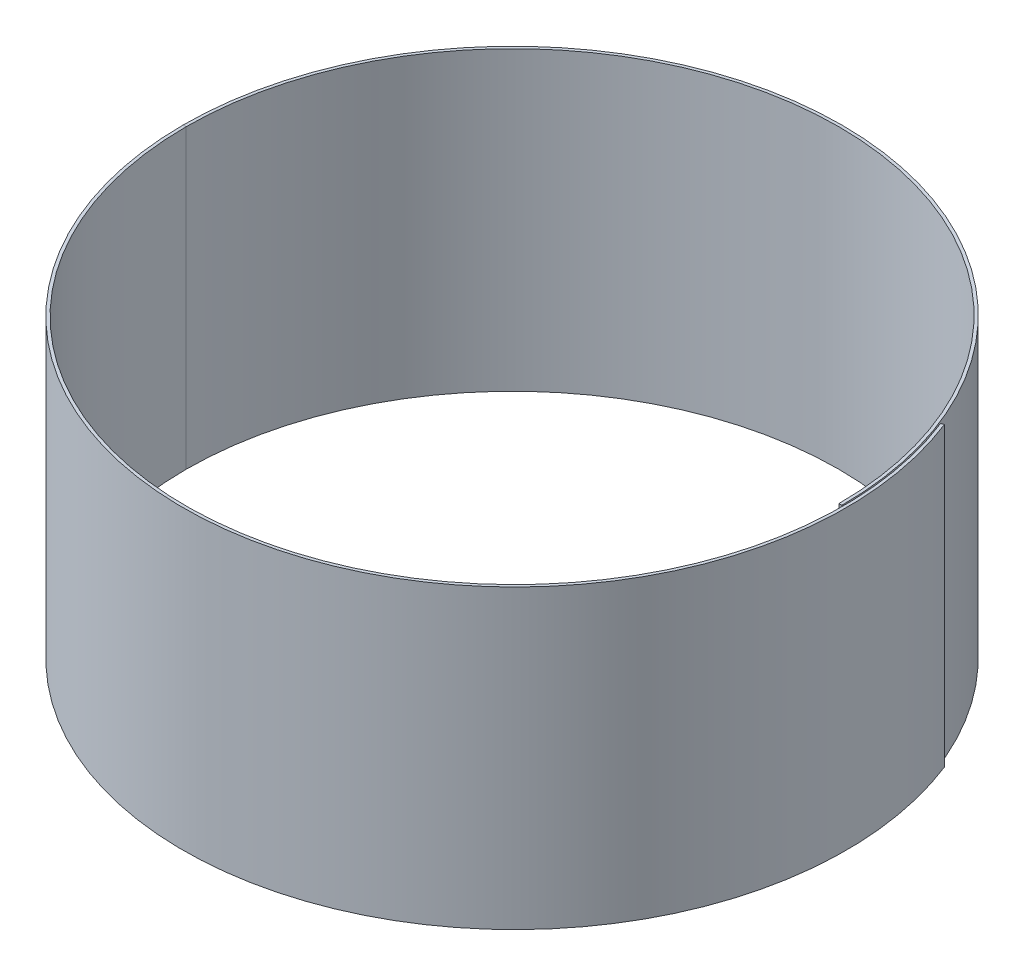
ISO-10303-21;
HEADER;
FILE_DESCRIPTION(('STEP AP214'),'2;1');
FILE_NAME('part.step','',(''),(''),'','','');
FILE_SCHEMA(('AUTOMOTIVE_DESIGN { 1 0 10303 214 1 1 1 1 }'));
ENDSEC;
DATA;
#1=APPLICATION_CONTEXT('core data for automotive mechanical design processes');
#2=APPLICATION_PROTOCOL_DEFINITION('international standard','automotive_design',2000,#1);
#3=PRODUCT_CONTEXT('',#1,'mechanical');
#4=PRODUCT('Part','Part','',(#3));
#5=PRODUCT_RELATED_PRODUCT_CATEGORY('part','',(#4));
#6=PRODUCT_DEFINITION_FORMATION('','',#4);
#7=PRODUCT_DEFINITION_CONTEXT('part definition',#1,'design');
#8=PRODUCT_DEFINITION('design','',#6,#7);
#9=PRODUCT_DEFINITION_SHAPE('','',#8);
#10=(LENGTH_UNIT() NAMED_UNIT(*) SI_UNIT(.MILLI.,.METRE.));
#11=(NAMED_UNIT(*) PLANE_ANGLE_UNIT() SI_UNIT($,.RADIAN.));
#12=(NAMED_UNIT(*) SI_UNIT($,.STERADIAN.) SOLID_ANGLE_UNIT());
#13=UNCERTAINTY_MEASURE_WITH_UNIT(LENGTH_MEASURE(1.E-05),#10,'distance_accuracy_value','');
#14=(GEOMETRIC_REPRESENTATION_CONTEXT(3) GLOBAL_UNCERTAINTY_ASSIGNED_CONTEXT((#13)) GLOBAL_UNIT_ASSIGNED_CONTEXT((#10,
#11,#12)) REPRESENTATION_CONTEXT('',''));
#15=CARTESIAN_POINT('',(0.,0.,0.));
#16=DIRECTION('',(0.,0.,1.));
#17=DIRECTION('',(1.,0.,0.));
#18=AXIS2_PLACEMENT_3D('',#15,#16,#17);
#19=CARTESIAN_POINT('',(27.5,-12.5,0.));
#20=DIRECTION('',(0.,0.,-1.));
#21=DIRECTION('',(0.,1.,0.));
#22=AXIS2_PLACEMENT_3D('',#19,#20,#21);
#23=PLANE('',#22);
#24=DIRECTION('',(-1.,0.,0.));
#25=VECTOR('',#24,1.);
#26=CARTESIAN_POINT('',(27.5,-25.,0.));
#27=LINE('',#26,#25);
#28=CARTESIAN_POINT('',(27.75,-25.,0.));
#29=VERTEX_POINT('',#28);
#30=CARTESIAN_POINT('',(27.5,-25.,0.));
#31=VERTEX_POINT('',#30);
#32=EDGE_CURVE('E72',#29,#31,#27,.T.);
#33=ORIENTED_EDGE('',*,*,#32,.F.);
#34=DIRECTION('',(0.,-1.,0.));
#35=VECTOR('',#34,1.);
#36=CARTESIAN_POINT('',(27.75,77.8158821644904,0.));
#37=LINE('',#36,#35);
#38=CARTESIAN_POINT('',(27.75,0.,0.));
#39=VERTEX_POINT('',#38);
#40=EDGE_CURVE('E147',#29,#39,#37,.F.);
#41=ORIENTED_EDGE('',*,*,#40,.T.);
#42=DIRECTION('',(-1.,0.,0.));
#43=VECTOR('',#42,1.);
#44=CARTESIAN_POINT('',(27.5,0.,0.));
#45=LINE('',#44,#43);
#46=CARTESIAN_POINT('',(27.5,0.,0.));
#47=VERTEX_POINT('',#46);
#48=EDGE_CURVE('E58',#39,#47,#45,.T.);
#49=ORIENTED_EDGE('',*,*,#48,.T.);
#50=DIRECTION('',(0.,1.,0.));
#51=VECTOR('',#50,1.);
#52=CARTESIAN_POINT('',(27.5,-25.,0.));
#53=LINE('',#52,#51);
#54=EDGE_CURVE('E138',#31,#47,#53,.T.);
#55=ORIENTED_EDGE('',*,*,#54,.F.);
#56=EDGE_LOOP('',(#33,#41,#49,#55));
#57=FACE_BOUND('',#56,.T.);
#58=ADVANCED_FACE('F39',(#57),#23,.F.);
#59=CARTESIAN_POINT('',(0.,77.8158821644904,0.));
#60=DIRECTION('',(0.,-1.,0.));
#61=DIRECTION('',(0.,0.,-1.));
#62=AXIS2_PLACEMENT_3D('',#59,#60,#61);
#63=CYLINDRICAL_SURFACE('',#62,27.5);
#64=CARTESIAN_POINT('',(0.,0.,0.));
#65=DIRECTION('',(0.,1.,0.));
#66=DIRECTION('',(0.,0.,1.));
#67=AXIS2_PLACEMENT_3D('',#64,#65,#66);
#68=CIRCLE('',#67,27.5);
#69=CARTESIAN_POINT('',(-27.5,0.,1.64365770551858E-13));
#70=VERTEX_POINT('',#69);
#71=EDGE_CURVE('E144',#47,#70,#68,.T.);
#72=ORIENTED_EDGE('',*,*,#71,.T.);
#73=DIRECTION('',(0.,1.,0.));
#74=VECTOR('',#73,1.);
#75=CARTESIAN_POINT('',(-27.5,-25.,-3.60822483003176E-13));
#76=LINE('',#75,#74);
#77=CARTESIAN_POINT('',(-27.5,-25.,-1.78551380066128E-13));
#78=VERTEX_POINT('',#77);
#79=EDGE_CURVE('E43',#78,#70,#76,.T.);
#80=ORIENTED_EDGE('',*,*,#79,.F.);
#81=CARTESIAN_POINT('',(0.,-25.,0.));
#82=DIRECTION('',(0.,-1.,0.));
#83=DIRECTION('',(0.,0.,-1.));
#84=AXIS2_PLACEMENT_3D('',#81,#82,#83);
#85=CIRCLE('',#84,27.5);
#86=EDGE_CURVE('E141',#78,#31,#85,.T.);
#87=ORIENTED_EDGE('',*,*,#86,.T.);
#88=ORIENTED_EDGE('',*,*,#54,.T.);
#89=EDGE_LOOP('',(#72,#80,#87,#88));
#90=FACE_BOUND('',#89,.T.);
#91=ADVANCED_FACE('F155',(#90),#63,.F.);
#92=CARTESIAN_POINT('',(0.,-25.,0.));
#93=DIRECTION('',(0.,1.,0.));
#94=DIRECTION('',(0.,0.,1.));
#95=AXIS2_PLACEMENT_3D('',#92,#93,#94);
#96=PLANE('',#95);
#97=DIRECTION('',(-1.,0.,0.));
#98=VECTOR('',#97,1.);
#99=CARTESIAN_POINT('',(-27.5,-25.,-3.60822483003176E-13));
#100=LINE('',#99,#98);
#101=CARTESIAN_POINT('',(-27.75,-25.,-3.60822483003176E-13));
#102=VERTEX_POINT('',#101);
#103=EDGE_CURVE('E135',#78,#102,#100,.T.);
#104=ORIENTED_EDGE('',*,*,#103,.T.);
#105=CARTESIAN_POINT('',(0.,-25.,0.));
#106=DIRECTION('',(0.,-1.,0.));
#107=DIRECTION('',(0.,0.,-1.));
#108=AXIS2_PLACEMENT_3D('',#105,#106,#107);
#109=CIRCLE('',#108,27.75);
#110=EDGE_CURVE('E132',#102,#29,#109,.T.);
#111=ORIENTED_EDGE('',*,*,#110,.T.);
#112=ORIENTED_EDGE('',*,*,#32,.T.);
#113=ORIENTED_EDGE('',*,*,#86,.F.);
#114=EDGE_LOOP('',(#104,#111,#112,#113));
#115=FACE_BOUND('',#114,.T.);
#116=ADVANCED_FACE('F159',(#115),#96,.F.);
#117=CARTESIAN_POINT('',(0.,77.8158821644904,0.));
#118=DIRECTION('',(0.,-1.,0.));
#119=DIRECTION('',(0.,0.,-1.));
#120=AXIS2_PLACEMENT_3D('',#117,#118,#119);
#121=CYLINDRICAL_SURFACE('',#120,27.75);
#122=CARTESIAN_POINT('',(0.,0.,0.));
#123=DIRECTION('',(0.,-1.,0.));
#124=DIRECTION('',(0.,0.,-1.));
#125=AXIS2_PLACEMENT_3D('',#122,#123,#124);
#126=CIRCLE('',#125,27.75);
#127=CARTESIAN_POINT('',(-27.75,0.,0.));
#128=VERTEX_POINT('',#127);
#129=EDGE_CURVE('E49',#39,#128,#126,.F.);
#130=ORIENTED_EDGE('',*,*,#129,.F.);
#131=ORIENTED_EDGE('',*,*,#40,.F.);
#132=ORIENTED_EDGE('',*,*,#110,.F.);
#133=DIRECTION('',(0.,1.,0.));
#134=VECTOR('',#133,1.);
#135=CARTESIAN_POINT('',(-27.75,-25.,-3.60822483003176E-13));
#136=LINE('',#135,#134);
#137=EDGE_CURVE('E117',#102,#128,#136,.T.);
#138=ORIENTED_EDGE('',*,*,#137,.T.);
#139=EDGE_LOOP('',(#130,#131,#132,#138));
#140=FACE_BOUND('',#139,.T.);
#141=ADVANCED_FACE('F157',(#140),#121,.T.);
#142=CARTESIAN_POINT('',(0.,0.,0.));
#143=DIRECTION('',(0.,-1.,0.));
#144=DIRECTION('',(0.,0.,-1.));
#145=AXIS2_PLACEMENT_3D('',#142,#143,#144);
#146=PLANE('',#145);
#147=ORIENTED_EDGE('',*,*,#48,.F.);
#148=ORIENTED_EDGE('',*,*,#129,.T.);
#149=DIRECTION('',(1.,0.,0.));
#150=VECTOR('',#149,1.);
#151=CARTESIAN_POINT('',(-27.75,0.,-3.60822483003176E-13));
#152=LINE('',#151,#150);
#153=EDGE_CURVE('E11',#128,#70,#152,.T.);
#154=ORIENTED_EDGE('',*,*,#153,.T.);
#155=ORIENTED_EDGE('',*,*,#71,.F.);
#156=EDGE_LOOP('',(#147,#148,#154,#155));
#157=FACE_BOUND('',#156,.T.);
#158=ADVANCED_FACE('F41',(#157),#146,.F.);
#159=CARTESIAN_POINT('',(0.181243091821423,-25.,-3.55737521140853E-13));
#160=DIRECTION('',(0.,1.,0.));
#161=DIRECTION('',(0.,0.,1.));
#162=AXIS2_PLACEMENT_3D('',#159,#160,#161);
#163=PLANE('',#162);
#164=DIRECTION('',(-0.930672552535848,0.,0.365853249208489));
#165=VECTOR('',#164,1.);
#166=CARTESIAN_POINT('',(25.9434162574522,-25.,-10.1272727272733));
#167=LINE('',#166,#165);
#168=CARTESIAN_POINT('',(26.1760843955861,-25.,-10.2187360395754));
#169=VERTEX_POINT('',#168);
#170=CARTESIAN_POINT('',(25.9434162574522,-25.,-10.1272727272733));
#171=VERTEX_POINT('',#170);
#172=EDGE_CURVE('E101',#169,#171,#167,.T.);
#173=ORIENTED_EDGE('',*,*,#172,.F.);
#174=CARTESIAN_POINT('',(0.181243091821423,-25.,-3.55737521140853E-13));
#175=DIRECTION('',(0.,-1.,0.));
#176=DIRECTION('',(0.,0.,-1.));
#177=AXIS2_PLACEMENT_3D('',#174,#175,#176);
#178=CIRCLE('',#177,27.9312430918214);
#179=EDGE_CURVE('E80',#169,#102,#178,.T.);
#180=ORIENTED_EDGE('',*,*,#179,.T.);
#181=ORIENTED_EDGE('',*,*,#103,.F.);
#182=CARTESIAN_POINT('',(0.181243091821423,-25.,-3.55737521140853E-13));
#183=DIRECTION('',(0.,-1.,0.));
#184=DIRECTION('',(0.,0.,-1.));
#185=AXIS2_PLACEMENT_3D('',#182,#183,#184);
#186=CIRCLE('',#185,27.6812430918214);
#187=EDGE_CURVE('E105',#171,#78,#186,.T.);
#188=ORIENTED_EDGE('',*,*,#187,.F.);
#189=EDGE_LOOP('',(#173,#180,#181,#188));
#190=FACE_BOUND('',#189,.T.);
#191=ADVANCED_FACE('F102',(#190),#163,.F.);
#192=CARTESIAN_POINT('',(0.181243091821423,0.,-3.55737521140853E-13));
#193=DIRECTION('',(0.,-1.,0.));
#194=DIRECTION('',(0.,0.,-1.));
#195=AXIS2_PLACEMENT_3D('',#192,#193,#194);
#196=PLANE('',#195);
#197=ORIENTED_EDGE('',*,*,#153,.F.);
#198=CARTESIAN_POINT('',(0.181243091821423,0.,-3.55737521140853E-13));
#199=DIRECTION('',(0.,-1.,0.));
#200=DIRECTION('',(0.,0.,-1.));
#201=AXIS2_PLACEMENT_3D('',#198,#199,#200);
#202=CIRCLE('',#201,27.9312430918214);
#203=CARTESIAN_POINT('',(26.1760843955861,0.,-10.2187360395754));
#204=VERTEX_POINT('',#203);
#205=EDGE_CURVE('E119',#128,#204,#202,.F.);
#206=ORIENTED_EDGE('',*,*,#205,.T.);
#207=DIRECTION('',(-0.930672552535848,0.,0.365853249208489));
#208=VECTOR('',#207,1.);
#209=CARTESIAN_POINT('',(25.9434162574522,0.,-10.1272727272733));
#210=LINE('',#209,#208);
#211=CARTESIAN_POINT('',(25.9434162574522,0.,-10.1272727272733));
#212=VERTEX_POINT('',#211);
#213=EDGE_CURVE('E89',#204,#212,#210,.T.);
#214=ORIENTED_EDGE('',*,*,#213,.T.);
#215=CARTESIAN_POINT('',(0.181243091821423,0.,-3.55737521140853E-13));
#216=DIRECTION('',(0.,1.,0.));
#217=DIRECTION('',(0.,0.,1.));
#218=AXIS2_PLACEMENT_3D('',#215,#216,#217);
#219=CIRCLE('',#218,27.6812430918214);
#220=EDGE_CURVE('E123',#70,#212,#219,.T.);
#221=ORIENTED_EDGE('',*,*,#220,.F.);
#222=EDGE_LOOP('',(#197,#206,#214,#221));
#223=FACE_BOUND('',#222,.T.);
#224=ADVANCED_FACE('F153',(#223),#196,.F.);
#225=CARTESIAN_POINT('',(25.9434162574522,-12.5,-10.1272727272733));
#226=DIRECTION('',(0.365853249208489,0.,0.930672552535848));
#227=DIRECTION('',(0.,-1.,0.));
#228=AXIS2_PLACEMENT_3D('',#225,#226,#227);
#229=PLANE('',#228);
#230=DIRECTION('',(0.,-1.,0.));
#231=VECTOR('',#230,1.);
#232=CARTESIAN_POINT('',(26.1760843955861,88.416662004553,-10.2187360395754));
#233=LINE('',#232,#231);
#234=EDGE_CURVE('E115',#204,#169,#233,.T.);
#235=ORIENTED_EDGE('',*,*,#234,.T.);
#236=ORIENTED_EDGE('',*,*,#172,.T.);
#237=DIRECTION('',(0.,-1.,0.));
#238=VECTOR('',#237,1.);
#239=CARTESIAN_POINT('',(25.9434162574522,0.,-10.1272727272733));
#240=LINE('',#239,#238);
#241=EDGE_CURVE('E127',#212,#171,#240,.T.);
#242=ORIENTED_EDGE('',*,*,#241,.F.);
#243=ORIENTED_EDGE('',*,*,#213,.F.);
#244=EDGE_LOOP('',(#235,#236,#242,#243));
#245=FACE_BOUND('',#244,.T.);
#246=ADVANCED_FACE('F121',(#245),#229,.F.);
#247=CARTESIAN_POINT('',(0.181243091821423,88.416662004553,-3.55737521140853E-13));
#248=DIRECTION('',(0.,-1.,0.));
#249=DIRECTION('',(0.,0.,-1.));
#250=AXIS2_PLACEMENT_3D('',#247,#248,#249);
#251=CYLINDRICAL_SURFACE('',#250,27.6812430918214);
#252=ORIENTED_EDGE('',*,*,#220,.T.);
#253=ORIENTED_EDGE('',*,*,#241,.T.);
#254=ORIENTED_EDGE('',*,*,#187,.T.);
#255=ORIENTED_EDGE('',*,*,#79,.T.);
#256=EDGE_LOOP('',(#252,#253,#254,#255));
#257=FACE_BOUND('',#256,.T.);
#258=ADVANCED_FACE('F150',(#257),#251,.F.);
#259=CARTESIAN_POINT('',(0.181243091821423,88.416662004553,-3.55737521140853E-13));
#260=DIRECTION('',(0.,-1.,0.));
#261=DIRECTION('',(0.,0.,-1.));
#262=AXIS2_PLACEMENT_3D('',#259,#260,#261);
#263=CYLINDRICAL_SURFACE('',#262,27.9312430918214);
#264=ORIENTED_EDGE('',*,*,#205,.F.);
#265=ORIENTED_EDGE('',*,*,#137,.F.);
#266=ORIENTED_EDGE('',*,*,#179,.F.);
#267=ORIENTED_EDGE('',*,*,#234,.F.);
#268=EDGE_LOOP('',(#264,#265,#266,#267));
#269=FACE_BOUND('',#268,.T.);
#270=ADVANCED_FACE('F114',(#269),#263,.T.);
#271=CLOSED_SHELL('',(#58,#91,#116,#141,#158,#191,#224,#246,#258,#270));
#272=MANIFOLD_SOLID_BREP('B2',#271);
#273=ADVANCED_BREP_SHAPE_REPRESENTATION('',(#18,#272),#14);
#274=SHAPE_DEFINITION_REPRESENTATION(#9,#273);
ENDSEC;
END-ISO-10303-21;
